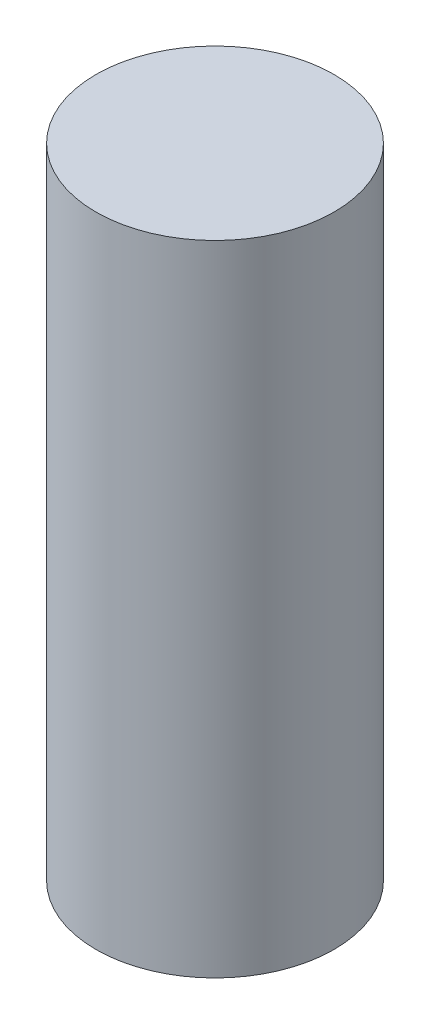
ISO-10303-21;
HEADER;
FILE_DESCRIPTION(('STEP AP214'),'2;1');
FILE_NAME('part.step','',(''),(''),'','','');
FILE_SCHEMA(('AUTOMOTIVE_DESIGN { 1 0 10303 214 1 1 1 1 }'));
ENDSEC;
DATA;
#1=APPLICATION_CONTEXT('core data for automotive mechanical design processes');
#2=APPLICATION_PROTOCOL_DEFINITION('international standard','automotive_design',2000,#1);
#3=PRODUCT_CONTEXT('',#1,'mechanical');
#4=PRODUCT('Part','Part','',(#3));
#5=PRODUCT_RELATED_PRODUCT_CATEGORY('part','',(#4));
#6=PRODUCT_DEFINITION_FORMATION('','',#4);
#7=PRODUCT_DEFINITION_CONTEXT('part definition',#1,'design');
#8=PRODUCT_DEFINITION('design','',#6,#7);
#9=PRODUCT_DEFINITION_SHAPE('','',#8);
#10=(LENGTH_UNIT() NAMED_UNIT(*) SI_UNIT(.MILLI.,.METRE.));
#11=(NAMED_UNIT(*) PLANE_ANGLE_UNIT() SI_UNIT($,.RADIAN.));
#12=(NAMED_UNIT(*) SI_UNIT($,.STERADIAN.) SOLID_ANGLE_UNIT());
#13=UNCERTAINTY_MEASURE_WITH_UNIT(LENGTH_MEASURE(1.E-05),#10,'distance_accuracy_value','');
#14=(GEOMETRIC_REPRESENTATION_CONTEXT(3) GLOBAL_UNCERTAINTY_ASSIGNED_CONTEXT((#13)) GLOBAL_UNIT_ASSIGNED_CONTEXT((#10,
#11,#12)) REPRESENTATION_CONTEXT('',''));
#15=CARTESIAN_POINT('',(0.,0.,0.));
#16=DIRECTION('',(0.,0.,1.));
#17=DIRECTION('',(1.,0.,0.));
#18=AXIS2_PLACEMENT_3D('',#15,#16,#17);
#19=CARTESIAN_POINT('',(0.,30.,0.));
#20=DIRECTION('',(0.,-1.,0.));
#21=DIRECTION('',(0.,0.,-1.));
#22=AXIS2_PLACEMENT_3D('',#19,#20,#21);
#23=CYLINDRICAL_SURFACE('',#22,5.595);
#24=CARTESIAN_POINT('',(0.,30.,0.));
#25=DIRECTION('',(0.,1.,0.));
#26=DIRECTION('',(0.,0.,1.));
#27=AXIS2_PLACEMENT_3D('',#24,#25,#26);
#28=CIRCLE('',#27,5.595);
#29=CARTESIAN_POINT('',(0.,30.,5.595));
#30=VERTEX_POINT('',#29);
#31=EDGE_CURVE('E10',#30,#30,#28,.T.);
#32=ORIENTED_EDGE('',*,*,#31,.F.);
#33=EDGE_LOOP('',(#32));
#34=FACE_BOUND('',#33,.T.);
#35=CARTESIAN_POINT('',(0.,0.,0.));
#36=DIRECTION('',(0.,1.,0.));
#37=DIRECTION('',(0.,0.,1.));
#38=AXIS2_PLACEMENT_3D('',#35,#36,#37);
#39=CIRCLE('',#38,5.595);
#40=CARTESIAN_POINT('',(0.,0.,5.595));
#41=VERTEX_POINT('',#40);
#42=EDGE_CURVE('E48',#41,#41,#39,.T.);
#43=ORIENTED_EDGE('',*,*,#42,.T.);
#44=EDGE_LOOP('',(#43));
#45=FACE_BOUND('',#44,.T.);
#46=ADVANCED_FACE('F45',(#34,#45),#23,.T.);
#47=CARTESIAN_POINT('',(0.,30.,0.));
#48=DIRECTION('',(0.,1.,0.));
#49=DIRECTION('',(0.,0.,1.));
#50=AXIS2_PLACEMENT_3D('',#47,#48,#49);
#51=PLANE('',#50);
#52=ORIENTED_EDGE('',*,*,#31,.T.);
#53=EDGE_LOOP('',(#52));
#54=FACE_BOUND('',#53,.T.);
#55=ADVANCED_FACE('F62',(#54),#51,.T.);
#56=CARTESIAN_POINT('',(0.,0.,0.));
#57=DIRECTION('',(0.,1.,0.));
#58=DIRECTION('',(0.,0.,1.));
#59=AXIS2_PLACEMENT_3D('',#56,#57,#58);
#60=PLANE('',#59);
#61=ORIENTED_EDGE('',*,*,#42,.F.);
#62=EDGE_LOOP('',(#61));
#63=FACE_BOUND('',#62,.T.);
#64=ADVANCED_FACE('F60',(#63),#60,.F.);
#65=CLOSED_SHELL('',(#46,#55,#64));
#66=MANIFOLD_SOLID_BREP('B2',#65);
#67=ADVANCED_BREP_SHAPE_REPRESENTATION('',(#18,#66),#14);
#68=SHAPE_DEFINITION_REPRESENTATION(#9,#67);
ENDSEC;
END-ISO-10303-21;
